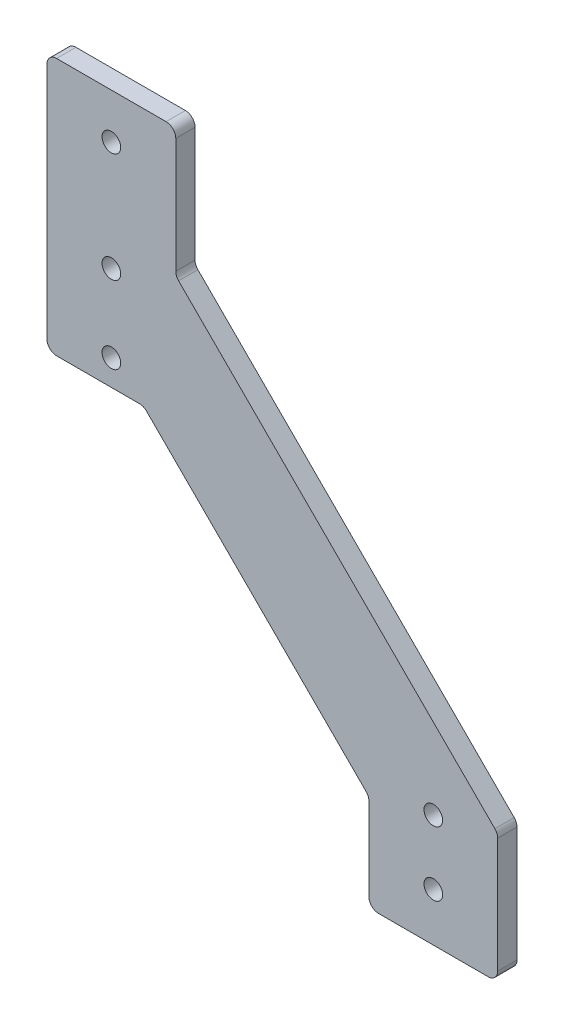
ISO-10303-21;
HEADER;
FILE_DESCRIPTION(('STEP AP214'),'2;1');
FILE_NAME('part.step','',(''),(''),'','','');
FILE_SCHEMA(('AUTOMOTIVE_DESIGN { 1 0 10303 214 1 1 1 1 }'));
ENDSEC;
DATA;
#1=APPLICATION_CONTEXT('core data for automotive mechanical design processes');
#2=APPLICATION_PROTOCOL_DEFINITION('international standard','automotive_design',2000,#1);
#3=PRODUCT_CONTEXT('',#1,'mechanical');
#4=PRODUCT('Part','Part','',(#3));
#5=PRODUCT_RELATED_PRODUCT_CATEGORY('part','',(#4));
#6=PRODUCT_DEFINITION_FORMATION('','',#4);
#7=PRODUCT_DEFINITION_CONTEXT('part definition',#1,'design');
#8=PRODUCT_DEFINITION('design','',#6,#7);
#9=PRODUCT_DEFINITION_SHAPE('','',#8);
#10=(LENGTH_UNIT() NAMED_UNIT(*) SI_UNIT(.MILLI.,.METRE.));
#11=(NAMED_UNIT(*) PLANE_ANGLE_UNIT() SI_UNIT($,.RADIAN.));
#12=(NAMED_UNIT(*) SI_UNIT($,.STERADIAN.) SOLID_ANGLE_UNIT());
#13=UNCERTAINTY_MEASURE_WITH_UNIT(LENGTH_MEASURE(1.E-05),#10,'distance_accuracy_value','');
#14=(GEOMETRIC_REPRESENTATION_CONTEXT(3) GLOBAL_UNCERTAINTY_ASSIGNED_CONTEXT((#13)) GLOBAL_UNIT_ASSIGNED_CONTEXT((#10,
#11,#12)) REPRESENTATION_CONTEXT('',''));
#15=CARTESIAN_POINT('',(0.,0.,0.));
#16=DIRECTION('',(0.,0.,1.));
#17=DIRECTION('',(1.,0.,0.));
#18=AXIS2_PLACEMENT_3D('',#15,#16,#17);
#19=CARTESIAN_POINT('',(0.,0.,3.));
#20=DIRECTION('',(0.,0.,1.));
#21=DIRECTION('',(1.,0.,0.));
#22=AXIS2_PLACEMENT_3D('',#19,#20,#21);
#23=PLANE('',#22);
#24=CARTESIAN_POINT('',(40.0000000000006,-52.4999999999993,3.));
#25=DIRECTION('',(0.,0.,1.));
#26=DIRECTION('',(1.,0.,0.));
#27=AXIS2_PLACEMENT_3D('',#24,#25,#26);
#28=CIRCLE('',#27,1.45);
#29=CARTESIAN_POINT('',(41.4500000000006,-52.4999999999993,3.));
#30=VERTEX_POINT('',#29);
#31=EDGE_CURVE('E601',#30,#30,#28,.T.);
#32=ORIENTED_EDGE('',*,*,#31,.F.);
#33=EDGE_LOOP('',(#32));
#34=FACE_BOUND('',#33,.T.);
#35=CARTESIAN_POINT('',(-9.99999999999927,-3.99999999999912,3.));
#36=DIRECTION('',(0.,0.,1.));
#37=DIRECTION('',(1.,0.,0.));
#38=AXIS2_PLACEMENT_3D('',#35,#36,#37);
#39=CIRCLE('',#38,1.45);
#40=CARTESIAN_POINT('',(-8.54999999999927,-3.99999999999912,3.));
#41=VERTEX_POINT('',#40);
#42=EDGE_CURVE('E313',#41,#41,#39,.T.);
#43=ORIENTED_EDGE('',*,*,#42,.F.);
#44=EDGE_LOOP('',(#43));
#45=FACE_BOUND('',#44,.T.);
#46=DIRECTION('',(0.,1.,0.));
#47=VECTOR('',#46,1.);
#48=CARTESIAN_POINT('',(50.0000000000014,-49.9999999999998,3.));
#49=LINE('',#48,#47);
#50=CARTESIAN_POINT('',(50.0000000000014,-68.4999999999997,3.));
#51=VERTEX_POINT('',#50);
#52=CARTESIAN_POINT('',(50.0000000000014,-50.6213203435594,3.));
#53=VERTEX_POINT('',#52);
#54=EDGE_CURVE('E299',#51,#53,#49,.T.);
#55=ORIENTED_EDGE('',*,*,#54,.T.);
#56=CARTESIAN_POINT('',(48.5000000000014,-50.6213203435594,3.));
#57=DIRECTION('',(0.,0.,1.));
#58=DIRECTION('',(1.,0.,0.));
#59=AXIS2_PLACEMENT_3D('',#56,#57,#58);
#60=CIRCLE('',#59,1.5);
#61=CARTESIAN_POINT('',(49.5606601717812,-49.5606601717796,3.));
#62=VERTEX_POINT('',#61);
#63=EDGE_CURVE('E259',#53,#62,#60,.T.);
#64=ORIENTED_EDGE('',*,*,#63,.T.);
#65=DIRECTION('',(-0.707106781186559,0.707106781186536,0.));
#66=VECTOR('',#65,1.);
#67=CARTESIAN_POINT('',(0.,0.,3.));
#68=LINE('',#67,#66);
#69=CARTESIAN_POINT('',(0.439339828220196,-0.439339828220182,3.));
#70=VERTEX_POINT('',#69);
#71=EDGE_CURVE('E293',#62,#70,#68,.T.);
#72=ORIENTED_EDGE('',*,*,#71,.T.);
#73=CARTESIAN_POINT('',(1.5,0.621320343559656,3.));
#74=DIRECTION('',(0.,0.,1.));
#75=DIRECTION('',(1.,0.,0.));
#76=AXIS2_PLACEMENT_3D('',#73,#74,#75);
#77=CIRCLE('',#76,1.5);
#78=CARTESIAN_POINT('',(0.,0.621320343559656,3.));
#79=VERTEX_POINT('',#78);
#80=EDGE_CURVE('E11',#70,#79,#77,.F.);
#81=ORIENTED_EDGE('',*,*,#80,.T.);
#82=DIRECTION('',(0.,1.,0.));
#83=VECTOR('',#82,1.);
#84=CARTESIAN_POINT('',(0.,0.,3.));
#85=LINE('',#84,#83);
#86=CARTESIAN_POINT('',(0.,18.5000000000005,3.));
#87=VERTEX_POINT('',#86);
#88=EDGE_CURVE('E292',#79,#87,#85,.T.);
#89=ORIENTED_EDGE('',*,*,#88,.T.);
#90=CARTESIAN_POINT('',(-1.5,18.5000000000005,3.));
#91=DIRECTION('',(0.,0.,1.));
#92=DIRECTION('',(1.,0.,0.));
#93=AXIS2_PLACEMENT_3D('',#90,#91,#92);
#94=CIRCLE('',#93,1.5);
#95=CARTESIAN_POINT('',(-1.5,20.0000000000005,3.));
#96=VERTEX_POINT('',#95);
#97=EDGE_CURVE('E57',#87,#96,#94,.T.);
#98=ORIENTED_EDGE('',*,*,#97,.T.);
#99=DIRECTION('',(-1.,0.,0.));
#100=VECTOR('',#99,1.);
#101=CARTESIAN_POINT('',(-19.9999999999985,20.0000000000005,3.));
#102=LINE('',#101,#100);
#103=CARTESIAN_POINT('',(-18.4999999999985,20.0000000000005,3.));
#104=VERTEX_POINT('',#103);
#105=EDGE_CURVE('E214',#96,#104,#102,.T.);
#106=ORIENTED_EDGE('',*,*,#105,.T.);
#107=CARTESIAN_POINT('',(-18.4999999999985,18.5000000000005,3.));
#108=DIRECTION('',(0.,0.,1.));
#109=DIRECTION('',(1.,0.,0.));
#110=AXIS2_PLACEMENT_3D('',#107,#108,#109);
#111=CIRCLE('',#110,1.5);
#112=CARTESIAN_POINT('',(-19.9999999999985,18.5000000000005,3.));
#113=VERTEX_POINT('',#112);
#114=EDGE_CURVE('E256',#104,#113,#111,.T.);
#115=ORIENTED_EDGE('',*,*,#114,.T.);
#116=DIRECTION('',(0.,-1.,0.));
#117=VECTOR('',#116,1.);
#118=CARTESIAN_POINT('',(-19.9999999999985,0.,3.));
#119=LINE('',#118,#117);
#120=CARTESIAN_POINT('',(-19.9999999999985,-18.4999999999996,3.));
#121=VERTEX_POINT('',#120);
#122=EDGE_CURVE('E213',#113,#121,#119,.T.);
#123=ORIENTED_EDGE('',*,*,#122,.T.);
#124=CARTESIAN_POINT('',(-18.4999999999985,-18.4999999999996,3.));
#125=DIRECTION('',(0.,0.,1.));
#126=DIRECTION('',(1.,0.,0.));
#127=AXIS2_PLACEMENT_3D('',#124,#125,#126);
#128=CIRCLE('',#127,1.5);
#129=CARTESIAN_POINT('',(-18.4999999999985,-19.9999999999996,3.));
#130=VERTEX_POINT('',#129);
#131=EDGE_CURVE('E250',#121,#130,#128,.T.);
#132=ORIENTED_EDGE('',*,*,#131,.T.);
#133=DIRECTION('',(1.,0.,0.));
#134=VECTOR('',#133,1.);
#135=CARTESIAN_POINT('',(-19.9999999999985,-19.9999999999996,3.));
#136=LINE('',#135,#134);
#137=CARTESIAN_POINT('',(-5.62132034355817,-19.9999999999996,3.));
#138=VERTEX_POINT('',#137);
#139=EDGE_CURVE('E321',#130,#138,#136,.T.);
#140=ORIENTED_EDGE('',*,*,#139,.T.);
#141=CARTESIAN_POINT('',(-5.62132034355817,-21.4999999999996,3.));
#142=DIRECTION('',(0.,0.,1.));
#143=DIRECTION('',(1.,0.,0.));
#144=AXIS2_PLACEMENT_3D('',#141,#142,#143);
#145=CIRCLE('',#144,1.5);
#146=CARTESIAN_POINT('',(-4.56066017177837,-20.4393398282197,3.));
#147=VERTEX_POINT('',#146);
#148=EDGE_CURVE('E277',#138,#147,#145,.F.);
#149=ORIENTED_EDGE('',*,*,#148,.T.);
#150=DIRECTION('',(0.707106781186563,-0.707106781186531,0.));
#151=VECTOR('',#150,1.);
#152=CARTESIAN_POINT('',(-4.99999999999855,-19.9999999999996,3.));
#153=LINE('',#152,#151);
#154=CARTESIAN_POINT('',(29.5606601717796,-54.5606601717761,3.));
#155=VERTEX_POINT('',#154);
#156=EDGE_CURVE('E324',#147,#155,#153,.T.);
#157=ORIENTED_EDGE('',*,*,#156,.T.);
#158=CARTESIAN_POINT('',(28.4999999999998,-55.621320343556,3.));
#159=DIRECTION('',(0.,0.,1.));
#160=DIRECTION('',(1.,0.,0.));
#161=AXIS2_PLACEMENT_3D('',#158,#159,#160);
#162=CIRCLE('',#161,1.5);
#163=CARTESIAN_POINT('',(29.9999999999998,-55.621320343556,3.));
#164=VERTEX_POINT('',#163);
#165=EDGE_CURVE('E171',#155,#164,#162,.F.);
#166=ORIENTED_EDGE('',*,*,#165,.T.);
#167=DIRECTION('',(0.,-1.,0.));
#168=VECTOR('',#167,1.);
#169=CARTESIAN_POINT('',(29.9999999999998,-54.9999999999963,3.));
#170=LINE('',#169,#168);
#171=CARTESIAN_POINT('',(29.9999999999998,-68.4999999999993,3.));
#172=VERTEX_POINT('',#171);
#173=EDGE_CURVE('E181',#164,#172,#170,.T.);
#174=ORIENTED_EDGE('',*,*,#173,.T.);
#175=CARTESIAN_POINT('',(31.4999999999998,-68.4999999999993,3.));
#176=DIRECTION('',(0.,0.,1.));
#177=DIRECTION('',(1.,0.,0.));
#178=AXIS2_PLACEMENT_3D('',#175,#176,#177);
#179=CIRCLE('',#178,1.5);
#180=CARTESIAN_POINT('',(31.4999999999997,-69.9999999999993,3.));
#181=VERTEX_POINT('',#180);
#182=EDGE_CURVE('E254',#172,#181,#179,.T.);
#183=ORIENTED_EDGE('',*,*,#182,.T.);
#184=DIRECTION('',(1.,0.,0.));
#185=VECTOR('',#184,1.);
#186=CARTESIAN_POINT('',(29.9999999999998,-69.9999999999993,3.));
#187=LINE('',#186,#185);
#188=CARTESIAN_POINT('',(48.5000000000013,-69.9999999999997,3.));
#189=VERTEX_POINT('',#188);
#190=EDGE_CURVE('E328',#181,#189,#187,.T.);
#191=ORIENTED_EDGE('',*,*,#190,.T.);
#192=CARTESIAN_POINT('',(48.5000000000014,-68.4999999999997,3.));
#193=DIRECTION('',(0.,0.,1.));
#194=DIRECTION('',(1.,0.,0.));
#195=AXIS2_PLACEMENT_3D('',#192,#193,#194);
#196=CIRCLE('',#195,1.5);
#197=EDGE_CURVE('E252',#189,#51,#196,.T.);
#198=ORIENTED_EDGE('',*,*,#197,.T.);
#199=EDGE_LOOP('',(#55,#64,#72,#81,#89,#98,#106,#115,#123,#132,#140,#149,#157,#166,#174,#183,
#191,#198));
#200=FACE_BOUND('',#199,.T.);
#201=CARTESIAN_POINT('',(-9.99999999999927,-15.9999999999991,3.));
#202=DIRECTION('',(0.,0.,1.));
#203=DIRECTION('',(1.,0.,0.));
#204=AXIS2_PLACEMENT_3D('',#201,#202,#203);
#205=CIRCLE('',#204,1.45);
#206=CARTESIAN_POINT('',(-8.54999999999927,-15.9999999999991,3.));
#207=VERTEX_POINT('',#206);
#208=EDGE_CURVE('E303',#207,#207,#205,.T.);
#209=ORIENTED_EDGE('',*,*,#208,.F.);
#210=EDGE_LOOP('',(#209));
#211=FACE_BOUND('',#210,.T.);
#212=CARTESIAN_POINT('',(40.0000000000006,-62.4999999999993,3.));
#213=DIRECTION('',(0.,0.,1.));
#214=DIRECTION('',(1.,0.,0.));
#215=AXIS2_PLACEMENT_3D('',#212,#213,#214);
#216=CIRCLE('',#215,1.45);
#217=CARTESIAN_POINT('',(41.4500000000006,-62.4999999999993,3.));
#218=VERTEX_POINT('',#217);
#219=EDGE_CURVE('E607',#218,#218,#216,.T.);
#220=ORIENTED_EDGE('',*,*,#219,.F.);
#221=EDGE_LOOP('',(#220));
#222=FACE_BOUND('',#221,.T.);
#223=CARTESIAN_POINT('',(-9.99999999999927,13.0000000000005,3.));
#224=DIRECTION('',(0.,0.,1.));
#225=DIRECTION('',(1.,0.,0.));
#226=AXIS2_PLACEMENT_3D('',#223,#224,#225);
#227=CIRCLE('',#226,1.45);
#228=CARTESIAN_POINT('',(-8.54999999999927,13.0000000000005,3.));
#229=VERTEX_POINT('',#228);
#230=EDGE_CURVE('E592',#229,#229,#227,.T.);
#231=ORIENTED_EDGE('',*,*,#230,.F.);
#232=EDGE_LOOP('',(#231));
#233=FACE_BOUND('',#232,.T.);
#234=ADVANCED_FACE('F35',(#34,#45,#200,#211,#222,#233),#23,.T.);
#235=CARTESIAN_POINT('',(0.,0.,0.));
#236=DIRECTION('',(0.,0.,1.));
#237=DIRECTION('',(1.,0.,0.));
#238=AXIS2_PLACEMENT_3D('',#235,#236,#237);
#239=PLANE('',#238);
#240=DIRECTION('',(-0.707106781186559,0.707106781186536,0.));
#241=VECTOR('',#240,1.);
#242=CARTESIAN_POINT('',(0.,0.,0.));
#243=LINE('',#242,#241);
#244=CARTESIAN_POINT('',(49.5606601717812,-49.5606601717796,0.));
#245=VERTEX_POINT('',#244);
#246=CARTESIAN_POINT('',(0.439339828220196,-0.439339828220182,0.));
#247=VERTEX_POINT('',#246);
#248=EDGE_CURVE('E202',#245,#247,#243,.T.);
#249=ORIENTED_EDGE('',*,*,#248,.F.);
#250=CARTESIAN_POINT('',(48.5000000000014,-50.6213203435594,0.));
#251=DIRECTION('',(0.,0.,1.));
#252=DIRECTION('',(1.,0.,0.));
#253=AXIS2_PLACEMENT_3D('',#250,#251,#252);
#254=CIRCLE('',#253,1.5);
#255=CARTESIAN_POINT('',(50.0000000000014,-50.6213203435594,0.));
#256=VERTEX_POINT('',#255);
#257=EDGE_CURVE('E243',#245,#256,#254,.F.);
#258=ORIENTED_EDGE('',*,*,#257,.T.);
#259=DIRECTION('',(0.,1.,0.));
#260=VECTOR('',#259,1.);
#261=CARTESIAN_POINT('',(50.0000000000014,-49.9999999999998,0.));
#262=LINE('',#261,#260);
#263=CARTESIAN_POINT('',(50.0000000000014,-68.4999999999997,0.));
#264=VERTEX_POINT('',#263);
#265=EDGE_CURVE('E194',#264,#256,#262,.T.);
#266=ORIENTED_EDGE('',*,*,#265,.F.);
#267=CARTESIAN_POINT('',(48.5000000000014,-68.4999999999997,0.));
#268=DIRECTION('',(0.,0.,1.));
#269=DIRECTION('',(1.,0.,0.));
#270=AXIS2_PLACEMENT_3D('',#267,#268,#269);
#271=CIRCLE('',#270,1.5);
#272=CARTESIAN_POINT('',(48.5000000000013,-69.9999999999997,0.));
#273=VERTEX_POINT('',#272);
#274=EDGE_CURVE('E236',#264,#273,#271,.F.);
#275=ORIENTED_EDGE('',*,*,#274,.T.);
#276=DIRECTION('',(1.,0.,0.));
#277=VECTOR('',#276,1.);
#278=CARTESIAN_POINT('',(29.9999999999998,-69.9999999999993,0.));
#279=LINE('',#278,#277);
#280=CARTESIAN_POINT('',(31.4999999999997,-69.9999999999993,0.));
#281=VERTEX_POINT('',#280);
#282=EDGE_CURVE('E190',#281,#273,#279,.T.);
#283=ORIENTED_EDGE('',*,*,#282,.F.);
#284=CARTESIAN_POINT('',(31.4999999999998,-68.4999999999993,0.));
#285=DIRECTION('',(0.,0.,1.));
#286=DIRECTION('',(1.,0.,0.));
#287=AXIS2_PLACEMENT_3D('',#284,#285,#286);
#288=CIRCLE('',#287,1.5);
#289=CARTESIAN_POINT('',(29.9999999999998,-68.4999999999993,0.));
#290=VERTEX_POINT('',#289);
#291=EDGE_CURVE('E189',#281,#290,#288,.F.);
#292=ORIENTED_EDGE('',*,*,#291,.T.);
#293=DIRECTION('',(0.,-1.,0.));
#294=VECTOR('',#293,1.);
#295=CARTESIAN_POINT('',(29.9999999999998,-54.9999999999963,0.));
#296=LINE('',#295,#294);
#297=CARTESIAN_POINT('',(29.9999999999998,-55.621320343556,0.));
#298=VERTEX_POINT('',#297);
#299=EDGE_CURVE('E178',#298,#290,#296,.T.);
#300=ORIENTED_EDGE('',*,*,#299,.F.);
#301=CARTESIAN_POINT('',(28.4999999999998,-55.621320343556,0.));
#302=DIRECTION('',(0.,0.,1.));
#303=DIRECTION('',(1.,0.,0.));
#304=AXIS2_PLACEMENT_3D('',#301,#302,#303);
#305=CIRCLE('',#304,1.5);
#306=CARTESIAN_POINT('',(29.5606601717796,-54.5606601717761,0.));
#307=VERTEX_POINT('',#306);
#308=EDGE_CURVE('E161',#298,#307,#305,.T.);
#309=ORIENTED_EDGE('',*,*,#308,.T.);
#310=DIRECTION('',(0.707106781186563,-0.707106781186531,0.));
#311=VECTOR('',#310,1.);
#312=CARTESIAN_POINT('',(-4.99999999999855,-19.9999999999996,0.));
#313=LINE('',#312,#311);
#314=CARTESIAN_POINT('',(-4.56066017177837,-20.4393398282197,0.));
#315=VERTEX_POINT('',#314);
#316=EDGE_CURVE('E191',#315,#307,#313,.T.);
#317=ORIENTED_EDGE('',*,*,#316,.F.);
#318=CARTESIAN_POINT('',(-5.62132034355817,-21.4999999999996,0.));
#319=DIRECTION('',(0.,0.,1.));
#320=DIRECTION('',(1.,0.,0.));
#321=AXIS2_PLACEMENT_3D('',#318,#319,#320);
#322=CIRCLE('',#321,1.5);
#323=CARTESIAN_POINT('',(-5.62132034355817,-19.9999999999996,0.));
#324=VERTEX_POINT('',#323);
#325=EDGE_CURVE('E275',#315,#324,#322,.T.);
#326=ORIENTED_EDGE('',*,*,#325,.T.);
#327=DIRECTION('',(1.,0.,0.));
#328=VECTOR('',#327,1.);
#329=CARTESIAN_POINT('',(-19.9999999999985,-19.9999999999996,0.));
#330=LINE('',#329,#328);
#331=CARTESIAN_POINT('',(-18.4999999999985,-19.9999999999996,0.));
#332=VERTEX_POINT('',#331);
#333=EDGE_CURVE('E196',#332,#324,#330,.T.);
#334=ORIENTED_EDGE('',*,*,#333,.F.);
#335=CARTESIAN_POINT('',(-18.4999999999985,-18.4999999999996,0.));
#336=DIRECTION('',(0.,0.,1.));
#337=DIRECTION('',(1.,0.,0.));
#338=AXIS2_PLACEMENT_3D('',#335,#336,#337);
#339=CIRCLE('',#338,1.5);
#340=CARTESIAN_POINT('',(-19.9999999999985,-18.4999999999996,0.));
#341=VERTEX_POINT('',#340);
#342=EDGE_CURVE('E234',#332,#341,#339,.F.);
#343=ORIENTED_EDGE('',*,*,#342,.T.);
#344=DIRECTION('',(0.,-1.,0.));
#345=VECTOR('',#344,1.);
#346=CARTESIAN_POINT('',(-19.9999999999985,0.,0.));
#347=LINE('',#346,#345);
#348=CARTESIAN_POINT('',(-19.9999999999985,18.5000000000005,0.));
#349=VERTEX_POINT('',#348);
#350=EDGE_CURVE('E210',#349,#341,#347,.T.);
#351=ORIENTED_EDGE('',*,*,#350,.F.);
#352=CARTESIAN_POINT('',(-18.4999999999985,18.5000000000005,0.));
#353=DIRECTION('',(0.,0.,1.));
#354=DIRECTION('',(1.,0.,0.));
#355=AXIS2_PLACEMENT_3D('',#352,#353,#354);
#356=CIRCLE('',#355,1.5);
#357=CARTESIAN_POINT('',(-18.4999999999985,20.0000000000005,0.));
#358=VERTEX_POINT('',#357);
#359=EDGE_CURVE('E239',#349,#358,#356,.F.);
#360=ORIENTED_EDGE('',*,*,#359,.T.);
#361=DIRECTION('',(-1.,0.,0.));
#362=VECTOR('',#361,1.);
#363=CARTESIAN_POINT('',(-19.9999999999985,20.0000000000005,0.));
#364=LINE('',#363,#362);
#365=CARTESIAN_POINT('',(-1.5,20.0000000000005,0.));
#366=VERTEX_POINT('',#365);
#367=EDGE_CURVE('E208',#366,#358,#364,.T.);
#368=ORIENTED_EDGE('',*,*,#367,.F.);
#369=CARTESIAN_POINT('',(-1.5,18.5000000000005,0.));
#370=DIRECTION('',(0.,0.,1.));
#371=DIRECTION('',(1.,0.,0.));
#372=AXIS2_PLACEMENT_3D('',#369,#370,#371);
#373=CIRCLE('',#372,1.5);
#374=CARTESIAN_POINT('',(0.,18.5000000000005,0.));
#375=VERTEX_POINT('',#374);
#376=EDGE_CURVE('E241',#366,#375,#373,.F.);
#377=ORIENTED_EDGE('',*,*,#376,.T.);
#378=DIRECTION('',(0.,1.,0.));
#379=VECTOR('',#378,1.);
#380=CARTESIAN_POINT('',(0.,0.,0.));
#381=LINE('',#380,#379);
#382=CARTESIAN_POINT('',(0.,0.621320343559656,0.));
#383=VERTEX_POINT('',#382);
#384=EDGE_CURVE('E205',#383,#375,#381,.T.);
#385=ORIENTED_EDGE('',*,*,#384,.F.);
#386=CARTESIAN_POINT('',(1.5,0.621320343559656,0.));
#387=DIRECTION('',(0.,0.,1.));
#388=DIRECTION('',(1.,0.,0.));
#389=AXIS2_PLACEMENT_3D('',#386,#387,#388);
#390=CIRCLE('',#389,1.5);
#391=EDGE_CURVE('E43',#383,#247,#390,.T.);
#392=ORIENTED_EDGE('',*,*,#391,.T.);
#393=EDGE_LOOP('',(#249,#258,#266,#275,#283,#292,#300,#309,#317,#326,#334,#343,#351,#360,#368,
#377,#385,#392));
#394=FACE_BOUND('',#393,.T.);
#395=CARTESIAN_POINT('',(-9.99999999999927,-15.9999999999991,0.));
#396=DIRECTION('',(0.,0.,1.));
#397=DIRECTION('',(1.,0.,0.));
#398=AXIS2_PLACEMENT_3D('',#395,#396,#397);
#399=CIRCLE('',#398,1.45);
#400=CARTESIAN_POINT('',(-8.54999999999927,-15.9999999999991,0.));
#401=VERTEX_POINT('',#400);
#402=EDGE_CURVE('E308',#401,#401,#399,.T.);
#403=ORIENTED_EDGE('',*,*,#402,.T.);
#404=EDGE_LOOP('',(#403));
#405=FACE_BOUND('',#404,.T.);
#406=CARTESIAN_POINT('',(-9.99999999999927,-3.99999999999912,0.));
#407=DIRECTION('',(0.,0.,1.));
#408=DIRECTION('',(1.,0.,0.));
#409=AXIS2_PLACEMENT_3D('',#406,#407,#408);
#410=CIRCLE('',#409,1.45);
#411=CARTESIAN_POINT('',(-8.54999999999927,-3.99999999999912,0.));
#412=VERTEX_POINT('',#411);
#413=EDGE_CURVE('E316',#412,#412,#410,.T.);
#414=ORIENTED_EDGE('',*,*,#413,.T.);
#415=EDGE_LOOP('',(#414));
#416=FACE_BOUND('',#415,.T.);
#417=CARTESIAN_POINT('',(40.0000000000006,-62.4999999999993,0.));
#418=DIRECTION('',(0.,0.,1.));
#419=DIRECTION('',(1.,0.,0.));
#420=AXIS2_PLACEMENT_3D('',#417,#418,#419);
#421=CIRCLE('',#420,1.45);
#422=CARTESIAN_POINT('',(41.4500000000006,-62.4999999999993,0.));
#423=VERTEX_POINT('',#422);
#424=EDGE_CURVE('E604',#423,#423,#421,.T.);
#425=ORIENTED_EDGE('',*,*,#424,.T.);
#426=EDGE_LOOP('',(#425));
#427=FACE_BOUND('',#426,.T.);
#428=CARTESIAN_POINT('',(40.0000000000006,-52.4999999999993,0.));
#429=DIRECTION('',(0.,0.,1.));
#430=DIRECTION('',(1.,0.,0.));
#431=AXIS2_PLACEMENT_3D('',#428,#429,#430);
#432=CIRCLE('',#431,1.45);
#433=CARTESIAN_POINT('',(41.4500000000006,-52.4999999999993,0.));
#434=VERTEX_POINT('',#433);
#435=EDGE_CURVE('E598',#434,#434,#432,.T.);
#436=ORIENTED_EDGE('',*,*,#435,.T.);
#437=EDGE_LOOP('',(#436));
#438=FACE_BOUND('',#437,.T.);
#439=CARTESIAN_POINT('',(-9.99999999999927,13.0000000000005,0.));
#440=DIRECTION('',(0.,0.,1.));
#441=DIRECTION('',(1.,0.,0.));
#442=AXIS2_PLACEMENT_3D('',#439,#440,#441);
#443=CIRCLE('',#442,1.45);
#444=CARTESIAN_POINT('',(-8.54999999999927,13.0000000000005,0.));
#445=VERTEX_POINT('',#444);
#446=EDGE_CURVE('E595',#445,#445,#443,.T.);
#447=ORIENTED_EDGE('',*,*,#446,.T.);
#448=EDGE_LOOP('',(#447));
#449=FACE_BOUND('',#448,.T.);
#450=ADVANCED_FACE('F186',(#394,#405,#416,#427,#438,#449),#239,.F.);
#451=CARTESIAN_POINT('',(-19.9999999999985,-19.9999999999996,3.));
#452=DIRECTION('',(0.,1.,0.));
#453=DIRECTION('',(0.,0.,1.));
#454=AXIS2_PLACEMENT_3D('',#451,#452,#453);
#455=PLANE('',#454);
#456=ORIENTED_EDGE('',*,*,#333,.T.);
#457=DIRECTION('',(0.,0.,-1.));
#458=VECTOR('',#457,1.);
#459=CARTESIAN_POINT('',(-5.62132034355817,-19.9999999999996,3.));
#460=LINE('',#459,#458);
#461=EDGE_CURVE('E222',#324,#138,#460,.F.);
#462=ORIENTED_EDGE('',*,*,#461,.T.);
#463=ORIENTED_EDGE('',*,*,#139,.F.);
#464=DIRECTION('',(0.,0.,-1.));
#465=VECTOR('',#464,1.);
#466=CARTESIAN_POINT('',(-18.4999999999985,-19.9999999999996,3.));
#467=LINE('',#466,#465);
#468=EDGE_CURVE('E219',#130,#332,#467,.T.);
#469=ORIENTED_EDGE('',*,*,#468,.T.);
#470=EDGE_LOOP('',(#456,#462,#463,#469));
#471=FACE_BOUND('',#470,.T.);
#472=ADVANCED_FACE('F367',(#471),#455,.F.);
#473=CARTESIAN_POINT('',(-4.99999999999855,-19.9999999999996,3.));
#474=DIRECTION('',(0.707106781186531,0.707106781186564,0.));
#475=DIRECTION('',(-0.707106781186564,0.707106781186531,0.));
#476=AXIS2_PLACEMENT_3D('',#473,#474,#475);
#477=PLANE('',#476);
#478=ORIENTED_EDGE('',*,*,#316,.T.);
#479=DIRECTION('',(0.,0.,-1.));
#480=VECTOR('',#479,1.);
#481=CARTESIAN_POINT('',(29.5606601717796,-54.5606601717761,3.));
#482=LINE('',#481,#480);
#483=EDGE_CURVE('E166',#307,#155,#482,.F.);
#484=ORIENTED_EDGE('',*,*,#483,.T.);
#485=ORIENTED_EDGE('',*,*,#156,.F.);
#486=DIRECTION('',(0.,0.,-1.));
#487=VECTOR('',#486,1.);
#488=CARTESIAN_POINT('',(-4.56066017177837,-20.4393398282197,0.));
#489=LINE('',#488,#487);
#490=EDGE_CURVE('E182',#147,#315,#489,.T.);
#491=ORIENTED_EDGE('',*,*,#490,.T.);
#492=EDGE_LOOP('',(#478,#484,#485,#491));
#493=FACE_BOUND('',#492,.T.);
#494=ADVANCED_FACE('F354',(#493),#477,.F.);
#495=CARTESIAN_POINT('',(29.9999999999998,-54.9999999999963,3.));
#496=DIRECTION('',(1.,0.,0.));
#497=DIRECTION('',(0.,0.,-1.));
#498=AXIS2_PLACEMENT_3D('',#495,#496,#497);
#499=PLANE('',#498);
#500=ORIENTED_EDGE('',*,*,#173,.F.);
#501=DIRECTION('',(0.,0.,-1.));
#502=VECTOR('',#501,1.);
#503=CARTESIAN_POINT('',(29.9999999999998,-55.621320343556,0.));
#504=LINE('',#503,#502);
#505=EDGE_CURVE('E165',#164,#298,#504,.T.);
#506=ORIENTED_EDGE('',*,*,#505,.T.);
#507=ORIENTED_EDGE('',*,*,#299,.T.);
#508=DIRECTION('',(0.,0.,-1.));
#509=VECTOR('',#508,1.);
#510=CARTESIAN_POINT('',(29.9999999999998,-68.4999999999993,3.));
#511=LINE('',#510,#509);
#512=EDGE_CURVE('E183',#290,#172,#511,.F.);
#513=ORIENTED_EDGE('',*,*,#512,.T.);
#514=EDGE_LOOP('',(#500,#506,#507,#513));
#515=FACE_BOUND('',#514,.T.);
#516=ADVANCED_FACE('F177',(#515),#499,.F.);
#517=CARTESIAN_POINT('',(29.9999999999998,-69.9999999999993,3.));
#518=DIRECTION('',(0.,1.,0.));
#519=DIRECTION('',(-1.,0.,0.));
#520=AXIS2_PLACEMENT_3D('',#517,#518,#519);
#521=PLANE('',#520);
#522=ORIENTED_EDGE('',*,*,#190,.F.);
#523=DIRECTION('',(0.,0.,-1.));
#524=VECTOR('',#523,1.);
#525=CARTESIAN_POINT('',(31.4999999999997,-69.9999999999993,3.));
#526=LINE('',#525,#524);
#527=EDGE_CURVE('E172',#181,#281,#526,.T.);
#528=ORIENTED_EDGE('',*,*,#527,.T.);
#529=ORIENTED_EDGE('',*,*,#282,.T.);
#530=DIRECTION('',(0.,0.,-1.));
#531=VECTOR('',#530,1.);
#532=CARTESIAN_POINT('',(48.5000000000013,-69.9999999999997,3.));
#533=LINE('',#532,#531);
#534=EDGE_CURVE('E270',#273,#189,#533,.F.);
#535=ORIENTED_EDGE('',*,*,#534,.T.);
#536=EDGE_LOOP('',(#522,#528,#529,#535));
#537=FACE_BOUND('',#536,.T.);
#538=ADVANCED_FACE('F345',(#537),#521,.F.);
#539=CARTESIAN_POINT('',(50.0000000000014,-49.9999999999998,3.));
#540=DIRECTION('',(-1.,0.,0.));
#541=DIRECTION('',(0.,0.,1.));
#542=AXIS2_PLACEMENT_3D('',#539,#540,#541);
#543=PLANE('',#542);
#544=ORIENTED_EDGE('',*,*,#265,.T.);
#545=DIRECTION('',(0.,0.,-1.));
#546=VECTOR('',#545,1.);
#547=CARTESIAN_POINT('',(50.0000000000014,-50.6213203435594,3.));
#548=LINE('',#547,#546);
#549=EDGE_CURVE('E248',#256,#53,#548,.F.);
#550=ORIENTED_EDGE('',*,*,#549,.T.);
#551=ORIENTED_EDGE('',*,*,#54,.F.);
#552=DIRECTION('',(0.,0.,-1.));
#553=VECTOR('',#552,1.);
#554=CARTESIAN_POINT('',(50.0000000000014,-68.4999999999997,3.));
#555=LINE('',#554,#553);
#556=EDGE_CURVE('E245',#51,#264,#555,.T.);
#557=ORIENTED_EDGE('',*,*,#556,.T.);
#558=EDGE_LOOP('',(#544,#550,#551,#557));
#559=FACE_BOUND('',#558,.T.);
#560=ADVANCED_FACE('F339',(#559),#543,.F.);
#561=CARTESIAN_POINT('',(0.,0.,3.));
#562=DIRECTION('',(-0.707106781186536,-0.707106781186559,0.));
#563=DIRECTION('',(0.707106781186559,-0.707106781186536,0.));
#564=AXIS2_PLACEMENT_3D('',#561,#562,#563);
#565=PLANE('',#564);
#566=ORIENTED_EDGE('',*,*,#248,.T.);
#567=DIRECTION('',(0.,0.,-1.));
#568=VECTOR('',#567,1.);
#569=CARTESIAN_POINT('',(0.439339828220196,-0.439339828220182,3.));
#570=LINE('',#569,#568);
#571=EDGE_CURVE('E232',#247,#70,#570,.F.);
#572=ORIENTED_EDGE('',*,*,#571,.T.);
#573=ORIENTED_EDGE('',*,*,#71,.F.);
#574=DIRECTION('',(0.,0.,-1.));
#575=VECTOR('',#574,1.);
#576=CARTESIAN_POINT('',(49.5606601717812,-49.5606601717796,3.));
#577=LINE('',#576,#575);
#578=EDGE_CURVE('E229',#62,#245,#577,.T.);
#579=ORIENTED_EDGE('',*,*,#578,.T.);
#580=EDGE_LOOP('',(#566,#572,#573,#579));
#581=FACE_BOUND('',#580,.T.);
#582=ADVANCED_FACE('F283',(#581),#565,.F.);
#583=CARTESIAN_POINT('',(0.,0.,3.));
#584=DIRECTION('',(-1.,0.,0.));
#585=DIRECTION('',(0.,0.,1.));
#586=AXIS2_PLACEMENT_3D('',#583,#584,#585);
#587=PLANE('',#586);
#588=ORIENTED_EDGE('',*,*,#88,.F.);
#589=DIRECTION('',(0.,0.,-1.));
#590=VECTOR('',#589,1.);
#591=CARTESIAN_POINT('',(0.,0.621320343559656,0.));
#592=LINE('',#591,#590);
#593=EDGE_CURVE('E226',#79,#383,#592,.T.);
#594=ORIENTED_EDGE('',*,*,#593,.T.);
#595=ORIENTED_EDGE('',*,*,#384,.T.);
#596=DIRECTION('',(0.,0.,-1.));
#597=VECTOR('',#596,1.);
#598=CARTESIAN_POINT('',(0.,18.5000000000005,3.));
#599=LINE('',#598,#597);
#600=EDGE_CURVE('E224',#375,#87,#599,.F.);
#601=ORIENTED_EDGE('',*,*,#600,.T.);
#602=EDGE_LOOP('',(#588,#594,#595,#601));
#603=FACE_BOUND('',#602,.T.);
#604=ADVANCED_FACE('F295',(#603),#587,.F.);
#605=CARTESIAN_POINT('',(-19.9999999999985,20.0000000000005,3.));
#606=DIRECTION('',(0.,-1.,0.));
#607=DIRECTION('',(0.,0.,-1.));
#608=AXIS2_PLACEMENT_3D('',#605,#606,#607);
#609=PLANE('',#608);
#610=ORIENTED_EDGE('',*,*,#105,.F.);
#611=DIRECTION('',(0.,0.,-1.));
#612=VECTOR('',#611,1.);
#613=CARTESIAN_POINT('',(-1.5,20.0000000000005,3.));
#614=LINE('',#613,#612);
#615=EDGE_CURVE('E262',#96,#366,#614,.T.);
#616=ORIENTED_EDGE('',*,*,#615,.T.);
#617=ORIENTED_EDGE('',*,*,#367,.T.);
#618=DIRECTION('',(0.,0.,-1.));
#619=VECTOR('',#618,1.);
#620=CARTESIAN_POINT('',(-18.4999999999985,20.0000000000005,3.));
#621=LINE('',#620,#619);
#622=EDGE_CURVE('E50',#358,#104,#621,.F.);
#623=ORIENTED_EDGE('',*,*,#622,.T.);
#624=EDGE_LOOP('',(#610,#616,#617,#623));
#625=FACE_BOUND('',#624,.T.);
#626=ADVANCED_FACE('F390',(#625),#609,.F.);
#627=CARTESIAN_POINT('',(-19.9999999999985,0.,3.));
#628=DIRECTION('',(1.,0.,0.));
#629=DIRECTION('',(0.,0.,-1.));
#630=AXIS2_PLACEMENT_3D('',#627,#628,#629);
#631=PLANE('',#630);
#632=ORIENTED_EDGE('',*,*,#122,.F.);
#633=DIRECTION('',(0.,0.,-1.));
#634=VECTOR('',#633,1.);
#635=CARTESIAN_POINT('',(-19.9999999999985,18.5000000000005,3.));
#636=LINE('',#635,#634);
#637=EDGE_CURVE('E267',#113,#349,#636,.T.);
#638=ORIENTED_EDGE('',*,*,#637,.T.);
#639=ORIENTED_EDGE('',*,*,#350,.T.);
#640=DIRECTION('',(0.,0.,-1.));
#641=VECTOR('',#640,1.);
#642=CARTESIAN_POINT('',(-19.9999999999985,-18.4999999999996,3.));
#643=LINE('',#642,#641);
#644=EDGE_CURVE('E265',#341,#121,#643,.F.);
#645=ORIENTED_EDGE('',*,*,#644,.T.);
#646=EDGE_LOOP('',(#632,#638,#639,#645));
#647=FACE_BOUND('',#646,.T.);
#648=ADVANCED_FACE('F363',(#647),#631,.F.);
#649=CARTESIAN_POINT('',(-9.99999999999927,-15.9999999999991,3.));
#650=DIRECTION('',(0.,0.,-1.));
#651=DIRECTION('',(-1.,0.,0.));
#652=AXIS2_PLACEMENT_3D('',#649,#650,#651);
#653=CYLINDRICAL_SURFACE('',#652,1.45);
#654=ORIENTED_EDGE('',*,*,#208,.T.);
#655=EDGE_LOOP('',(#654));
#656=FACE_BOUND('',#655,.T.);
#657=ORIENTED_EDGE('',*,*,#402,.F.);
#658=EDGE_LOOP('',(#657));
#659=FACE_BOUND('',#658,.T.);
#660=ADVANCED_FACE('F385',(#656,#659),#653,.F.);
#661=CARTESIAN_POINT('',(-9.99999999999927,-3.99999999999912,3.));
#662=DIRECTION('',(0.,0.,-1.));
#663=DIRECTION('',(-1.,0.,0.));
#664=AXIS2_PLACEMENT_3D('',#661,#662,#663);
#665=CYLINDRICAL_SURFACE('',#664,1.45);
#666=ORIENTED_EDGE('',*,*,#42,.T.);
#667=EDGE_LOOP('',(#666));
#668=FACE_BOUND('',#667,.T.);
#669=ORIENTED_EDGE('',*,*,#413,.F.);
#670=EDGE_LOOP('',(#669));
#671=FACE_BOUND('',#670,.T.);
#672=ADVANCED_FACE('F437',(#668,#671),#665,.F.);
#673=CARTESIAN_POINT('',(40.0000000000006,-62.4999999999993,3.));
#674=DIRECTION('',(0.,0.,-1.));
#675=DIRECTION('',(-1.,0.,0.));
#676=AXIS2_PLACEMENT_3D('',#673,#674,#675);
#677=CYLINDRICAL_SURFACE('',#676,1.45);
#678=ORIENTED_EDGE('',*,*,#219,.T.);
#679=EDGE_LOOP('',(#678));
#680=FACE_BOUND('',#679,.T.);
#681=ORIENTED_EDGE('',*,*,#424,.F.);
#682=EDGE_LOOP('',(#681));
#683=FACE_BOUND('',#682,.T.);
#684=ADVANCED_FACE('F443',(#680,#683),#677,.F.);
#685=CARTESIAN_POINT('',(40.0000000000006,-52.4999999999993,3.));
#686=DIRECTION('',(0.,0.,-1.));
#687=DIRECTION('',(-1.,0.,0.));
#688=AXIS2_PLACEMENT_3D('',#685,#686,#687);
#689=CYLINDRICAL_SURFACE('',#688,1.45);
#690=ORIENTED_EDGE('',*,*,#31,.T.);
#691=EDGE_LOOP('',(#690));
#692=FACE_BOUND('',#691,.T.);
#693=ORIENTED_EDGE('',*,*,#435,.F.);
#694=EDGE_LOOP('',(#693));
#695=FACE_BOUND('',#694,.T.);
#696=ADVANCED_FACE('F450',(#692,#695),#689,.F.);
#697=CARTESIAN_POINT('',(-9.99999999999927,13.0000000000005,3.));
#698=DIRECTION('',(0.,0.,-1.));
#699=DIRECTION('',(-1.,0.,0.));
#700=AXIS2_PLACEMENT_3D('',#697,#698,#699);
#701=CYLINDRICAL_SURFACE('',#700,1.45);
#702=ORIENTED_EDGE('',*,*,#230,.T.);
#703=EDGE_LOOP('',(#702));
#704=FACE_BOUND('',#703,.T.);
#705=ORIENTED_EDGE('',*,*,#446,.F.);
#706=EDGE_LOOP('',(#705));
#707=FACE_BOUND('',#706,.T.);
#708=ADVANCED_FACE('F458',(#704,#707),#701,.F.);
#709=CARTESIAN_POINT('',(28.4999999999998,-55.621320343556,3.));
#710=DIRECTION('',(0.,0.,1.));
#711=DIRECTION('',(1.,0.,0.));
#712=AXIS2_PLACEMENT_3D('',#709,#710,#711);
#713=CYLINDRICAL_SURFACE('',#712,1.5);
#714=ORIENTED_EDGE('',*,*,#165,.F.);
#715=ORIENTED_EDGE('',*,*,#483,.F.);
#716=ORIENTED_EDGE('',*,*,#308,.F.);
#717=ORIENTED_EDGE('',*,*,#505,.F.);
#718=EDGE_LOOP('',(#714,#715,#716,#717));
#719=FACE_BOUND('',#718,.T.);
#720=ADVANCED_FACE('F164',(#719),#713,.F.);
#721=CARTESIAN_POINT('',(-5.62132034355817,-21.4999999999996,3.));
#722=DIRECTION('',(0.,0.,1.));
#723=DIRECTION('',(1.,0.,0.));
#724=AXIS2_PLACEMENT_3D('',#721,#722,#723);
#725=CYLINDRICAL_SURFACE('',#724,1.5);
#726=ORIENTED_EDGE('',*,*,#148,.F.);
#727=ORIENTED_EDGE('',*,*,#461,.F.);
#728=ORIENTED_EDGE('',*,*,#325,.F.);
#729=ORIENTED_EDGE('',*,*,#490,.F.);
#730=EDGE_LOOP('',(#726,#727,#728,#729));
#731=FACE_BOUND('',#730,.T.);
#732=ADVANCED_FACE('F356',(#731),#725,.F.);
#733=CARTESIAN_POINT('',(1.5,0.621320343559656,3.));
#734=DIRECTION('',(0.,0.,1.));
#735=DIRECTION('',(1.,0.,0.));
#736=AXIS2_PLACEMENT_3D('',#733,#734,#735);
#737=CYLINDRICAL_SURFACE('',#736,1.5);
#738=ORIENTED_EDGE('',*,*,#80,.F.);
#739=ORIENTED_EDGE('',*,*,#571,.F.);
#740=ORIENTED_EDGE('',*,*,#391,.F.);
#741=ORIENTED_EDGE('',*,*,#593,.F.);
#742=EDGE_LOOP('',(#738,#739,#740,#741));
#743=FACE_BOUND('',#742,.T.);
#744=ADVANCED_FACE('F288',(#743),#737,.F.);
#745=CARTESIAN_POINT('',(48.5000000000014,-50.6213203435594,3.));
#746=DIRECTION('',(0.,0.,-1.));
#747=DIRECTION('',(-1.,0.,0.));
#748=AXIS2_PLACEMENT_3D('',#745,#746,#747);
#749=CYLINDRICAL_SURFACE('',#748,1.5);
#750=ORIENTED_EDGE('',*,*,#63,.F.);
#751=ORIENTED_EDGE('',*,*,#549,.F.);
#752=ORIENTED_EDGE('',*,*,#257,.F.);
#753=ORIENTED_EDGE('',*,*,#578,.F.);
#754=EDGE_LOOP('',(#750,#751,#752,#753));
#755=FACE_BOUND('',#754,.T.);
#756=ADVANCED_FACE('F337',(#755),#749,.T.);
#757=CARTESIAN_POINT('',(-1.5,18.5000000000005,3.));
#758=DIRECTION('',(0.,0.,-1.));
#759=DIRECTION('',(-1.,0.,0.));
#760=AXIS2_PLACEMENT_3D('',#757,#758,#759);
#761=CYLINDRICAL_SURFACE('',#760,1.5);
#762=ORIENTED_EDGE('',*,*,#97,.F.);
#763=ORIENTED_EDGE('',*,*,#600,.F.);
#764=ORIENTED_EDGE('',*,*,#376,.F.);
#765=ORIENTED_EDGE('',*,*,#615,.F.);
#766=EDGE_LOOP('',(#762,#763,#764,#765));
#767=FACE_BOUND('',#766,.T.);
#768=ADVANCED_FACE('F489',(#767),#761,.T.);
#769=CARTESIAN_POINT('',(-18.4999999999985,18.5000000000005,3.));
#770=DIRECTION('',(0.,0.,-1.));
#771=DIRECTION('',(-1.,0.,0.));
#772=AXIS2_PLACEMENT_3D('',#769,#770,#771);
#773=CYLINDRICAL_SURFACE('',#772,1.5);
#774=ORIENTED_EDGE('',*,*,#114,.F.);
#775=ORIENTED_EDGE('',*,*,#622,.F.);
#776=ORIENTED_EDGE('',*,*,#359,.F.);
#777=ORIENTED_EDGE('',*,*,#637,.F.);
#778=EDGE_LOOP('',(#774,#775,#776,#777));
#779=FACE_BOUND('',#778,.T.);
#780=ADVANCED_FACE('F496',(#779),#773,.T.);
#781=CARTESIAN_POINT('',(31.4999999999998,-68.4999999999993,3.));
#782=DIRECTION('',(0.,0.,-1.));
#783=DIRECTION('',(-1.,0.,0.));
#784=AXIS2_PLACEMENT_3D('',#781,#782,#783);
#785=CYLINDRICAL_SURFACE('',#784,1.5);
#786=ORIENTED_EDGE('',*,*,#182,.F.);
#787=ORIENTED_EDGE('',*,*,#512,.F.);
#788=ORIENTED_EDGE('',*,*,#291,.F.);
#789=ORIENTED_EDGE('',*,*,#527,.F.);
#790=EDGE_LOOP('',(#786,#787,#788,#789));
#791=FACE_BOUND('',#790,.T.);
#792=ADVANCED_FACE('F349',(#791),#785,.T.);
#793=CARTESIAN_POINT('',(48.5000000000014,-68.4999999999997,3.));
#794=DIRECTION('',(0.,0.,-1.));
#795=DIRECTION('',(-1.,0.,0.));
#796=AXIS2_PLACEMENT_3D('',#793,#794,#795);
#797=CYLINDRICAL_SURFACE('',#796,1.5);
#798=ORIENTED_EDGE('',*,*,#197,.F.);
#799=ORIENTED_EDGE('',*,*,#534,.F.);
#800=ORIENTED_EDGE('',*,*,#274,.F.);
#801=ORIENTED_EDGE('',*,*,#556,.F.);
#802=EDGE_LOOP('',(#798,#799,#800,#801));
#803=FACE_BOUND('',#802,.T.);
#804=ADVANCED_FACE('F341',(#803),#797,.T.);
#805=CARTESIAN_POINT('',(-18.4999999999985,-18.4999999999996,3.));
#806=DIRECTION('',(0.,0.,-1.));
#807=DIRECTION('',(-1.,0.,0.));
#808=AXIS2_PLACEMENT_3D('',#805,#806,#807);
#809=CYLINDRICAL_SURFACE('',#808,1.5);
#810=ORIENTED_EDGE('',*,*,#131,.F.);
#811=ORIENTED_EDGE('',*,*,#644,.F.);
#812=ORIENTED_EDGE('',*,*,#342,.F.);
#813=ORIENTED_EDGE('',*,*,#468,.F.);
#814=EDGE_LOOP('',(#810,#811,#812,#813));
#815=FACE_BOUND('',#814,.T.);
#816=ADVANCED_FACE('F37',(#815),#809,.T.);
#817=CLOSED_SHELL('',(#234,#450,#472,#494,#516,#538,#560,#582,#604,#626,#648,#660,#672,#684,
#696,#708,#720,#732,#744,#756,#768,#780,#792,#804,#816));
#818=MANIFOLD_SOLID_BREP('B2',#817);
#819=ADVANCED_BREP_SHAPE_REPRESENTATION('',(#18,#818),#14);
#820=SHAPE_DEFINITION_REPRESENTATION(#9,#819);
ENDSEC;
END-ISO-10303-21;
